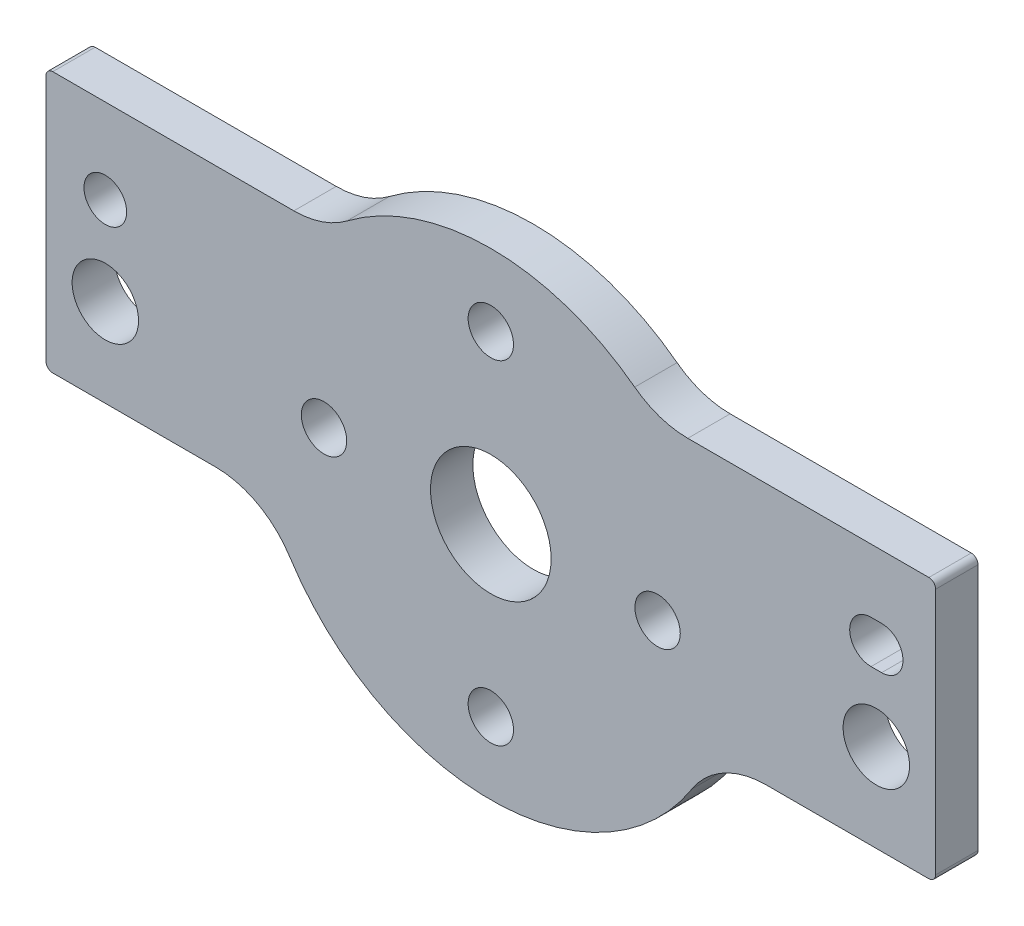
ISO-10303-21;
HEADER;
FILE_DESCRIPTION(('STEP AP214'),'2;1');
FILE_NAME('part.step','',(''),(''),'','','');
FILE_SCHEMA(('AUTOMOTIVE_DESIGN { 1 0 10303 214 1 1 1 1 }'));
ENDSEC;
DATA;
#1=APPLICATION_CONTEXT('core data for automotive mechanical design processes');
#2=APPLICATION_PROTOCOL_DEFINITION('international standard','automotive_design',2000,#1);
#3=PRODUCT_CONTEXT('',#1,'mechanical');
#4=PRODUCT('Part','Part','',(#3));
#5=PRODUCT_RELATED_PRODUCT_CATEGORY('part','',(#4));
#6=PRODUCT_DEFINITION_FORMATION('','',#4);
#7=PRODUCT_DEFINITION_CONTEXT('part definition',#1,'design');
#8=PRODUCT_DEFINITION('design','',#6,#7);
#9=PRODUCT_DEFINITION_SHAPE('','',#8);
#10=(LENGTH_UNIT() NAMED_UNIT(*) SI_UNIT(.MILLI.,.METRE.));
#11=(NAMED_UNIT(*) PLANE_ANGLE_UNIT() SI_UNIT($,.RADIAN.));
#12=(NAMED_UNIT(*) SI_UNIT($,.STERADIAN.) SOLID_ANGLE_UNIT());
#13=UNCERTAINTY_MEASURE_WITH_UNIT(LENGTH_MEASURE(1.E-05),#10,'distance_accuracy_value','');
#14=(GEOMETRIC_REPRESENTATION_CONTEXT(3) GLOBAL_UNCERTAINTY_ASSIGNED_CONTEXT((#13)) GLOBAL_UNIT_ASSIGNED_CONTEXT((#10,
#11,#12)) REPRESENTATION_CONTEXT('',''));
#15=CARTESIAN_POINT('',(0.,0.,0.));
#16=DIRECTION('',(0.,0.,1.));
#17=DIRECTION('',(1.,0.,0.));
#18=AXIS2_PLACEMENT_3D('',#15,#16,#17);
#19=CARTESIAN_POINT('',(0.,0.,3.175));
#20=DIRECTION('',(0.,0.,-1.));
#21=DIRECTION('',(-1.,0.,0.));
#22=AXIS2_PLACEMENT_3D('',#19,#20,#21);
#23=PLANE('',#22);
#24=CARTESIAN_POINT('',(-28.8925,6.604,3.175));
#25=DIRECTION('',(0.,0.,1.));
#26=DIRECTION('',(1.,0.,0.));
#27=AXIS2_PLACEMENT_3D('',#24,#25,#26);
#28=CIRCLE('',#27,1.6002);
#29=CARTESIAN_POINT('',(-27.2923,6.604,3.175));
#30=VERTEX_POINT('',#29);
#31=EDGE_CURVE('E201',#30,#30,#28,.T.);
#32=ORIENTED_EDGE('',*,*,#31,.F.);
#33=EDGE_LOOP('',(#32));
#34=FACE_BOUND('',#33,.T.);
#35=DIRECTION('',(1.,0.,0.));
#36=VECTOR('',#35,1.);
#37=CARTESIAN_POINT('',(28.495625,5.0038,3.175));
#38=LINE('',#37,#36);
#39=CARTESIAN_POINT('',(28.495625,5.0038,3.175));
#40=VERTEX_POINT('',#39);
#41=CARTESIAN_POINT('',(29.289375,5.0038,3.175));
#42=VERTEX_POINT('',#41);
#43=EDGE_CURVE('E199',#40,#42,#38,.T.);
#44=ORIENTED_EDGE('',*,*,#43,.F.);
#45=CARTESIAN_POINT('',(28.495625,6.604,3.175));
#46=DIRECTION('',(0.,0.,1.));
#47=DIRECTION('',(1.,0.,0.));
#48=AXIS2_PLACEMENT_3D('',#45,#46,#47);
#49=CIRCLE('',#48,1.6002);
#50=CARTESIAN_POINT('',(28.495625,8.20419999999999,3.175));
#51=VERTEX_POINT('',#50);
#52=EDGE_CURVE('E56',#51,#40,#49,.T.);
#53=ORIENTED_EDGE('',*,*,#52,.F.);
#54=DIRECTION('',(-1.,0.,0.));
#55=VECTOR('',#54,1.);
#56=CARTESIAN_POINT('',(28.495625,8.20419999999999,3.175));
#57=LINE('',#56,#55);
#58=CARTESIAN_POINT('',(29.289375,8.20419999999999,3.175));
#59=VERTEX_POINT('',#58);
#60=EDGE_CURVE('E188',#59,#51,#57,.T.);
#61=ORIENTED_EDGE('',*,*,#60,.F.);
#62=CARTESIAN_POINT('',(29.289375,6.604,3.175));
#63=DIRECTION('',(0.,0.,1.));
#64=DIRECTION('',(1.,0.,0.));
#65=AXIS2_PLACEMENT_3D('',#62,#63,#64);
#66=CIRCLE('',#65,1.6002);
#67=EDGE_CURVE('E194',#42,#59,#66,.T.);
#68=ORIENTED_EDGE('',*,*,#67,.F.);
#69=EDGE_LOOP('',(#44,#53,#61,#68));
#70=FACE_BOUND('',#69,.T.);
#71=CARTESIAN_POINT('',(0.,12.5,3.175));
#72=DIRECTION('',(0.,0.,1.));
#73=DIRECTION('',(1.,0.,0.));
#74=AXIS2_PLACEMENT_3D('',#71,#72,#73);
#75=CIRCLE('',#74,1.7);
#76=CARTESIAN_POINT('',(1.7,12.5,3.175));
#77=VERTEX_POINT('',#76);
#78=EDGE_CURVE('E224',#77,#77,#75,.T.);
#79=ORIENTED_EDGE('',*,*,#78,.F.);
#80=EDGE_LOOP('',(#79));
#81=FACE_BOUND('',#80,.T.);
#82=CARTESIAN_POINT('',(-12.5,0.,3.175));
#83=DIRECTION('',(0.,0.,1.));
#84=DIRECTION('',(1.,0.,0.));
#85=AXIS2_PLACEMENT_3D('',#82,#83,#84);
#86=CIRCLE('',#85,1.7);
#87=CARTESIAN_POINT('',(-10.8,0.,3.175));
#88=VERTEX_POINT('',#87);
#89=EDGE_CURVE('E232',#88,#88,#86,.T.);
#90=ORIENTED_EDGE('',*,*,#89,.F.);
#91=EDGE_LOOP('',(#90));
#92=FACE_BOUND('',#91,.T.);
#93=CARTESIAN_POINT('',(0.,-12.5,3.175));
#94=DIRECTION('',(0.,0.,1.));
#95=DIRECTION('',(1.,0.,0.));
#96=AXIS2_PLACEMENT_3D('',#93,#94,#95);
#97=CIRCLE('',#96,1.7);
#98=CARTESIAN_POINT('',(1.7,-12.5,3.175));
#99=VERTEX_POINT('',#98);
#100=EDGE_CURVE('E240',#99,#99,#97,.T.);
#101=ORIENTED_EDGE('',*,*,#100,.F.);
#102=EDGE_LOOP('',(#101));
#103=FACE_BOUND('',#102,.T.);
#104=CARTESIAN_POINT('',(0.,0.,3.175));
#105=DIRECTION('',(0.,0.,1.));
#106=DIRECTION('',(1.,0.,0.));
#107=AXIS2_PLACEMENT_3D('',#104,#105,#106);
#108=CIRCLE('',#107,4.5212);
#109=CARTESIAN_POINT('',(4.5212,0.,3.175));
#110=VERTEX_POINT('',#109);
#111=EDGE_CURVE('E256',#110,#110,#108,.T.);
#112=ORIENTED_EDGE('',*,*,#111,.F.);
#113=EDGE_LOOP('',(#112));
#114=FACE_BOUND('',#113,.T.);
#115=CARTESIAN_POINT('',(28.8925,0.,3.175));
#116=DIRECTION('',(0.,0.,1.));
#117=DIRECTION('',(1.,0.,0.));
#118=AXIS2_PLACEMENT_3D('',#115,#116,#117);
#119=CIRCLE('',#118,2.48919999999999);
#120=CARTESIAN_POINT('',(31.3817,0.,3.175));
#121=VERTEX_POINT('',#120);
#122=EDGE_CURVE('E261',#121,#121,#119,.T.);
#123=ORIENTED_EDGE('',*,*,#122,.F.);
#124=EDGE_LOOP('',(#123));
#125=FACE_BOUND('',#124,.T.);
#126=CARTESIAN_POINT('',(-28.8925,0.,3.175));
#127=DIRECTION('',(0.,0.,1.));
#128=DIRECTION('',(1.,0.,0.));
#129=AXIS2_PLACEMENT_3D('',#126,#127,#128);
#130=CIRCLE('',#129,2.48919999999999);
#131=CARTESIAN_POINT('',(-26.4033,0.,3.175));
#132=VERTEX_POINT('',#131);
#133=EDGE_CURVE('E272',#132,#132,#130,.T.);
#134=ORIENTED_EDGE('',*,*,#133,.F.);
#135=EDGE_LOOP('',(#134));
#136=FACE_BOUND('',#135,.T.);
#137=DIRECTION('',(0.,1.,0.));
#138=VECTOR('',#137,1.);
#139=CARTESIAN_POINT('',(33.3375,6.604,3.175));
#140=LINE('',#139,#138);
#141=CARTESIAN_POINT('',(33.3375,-6.09599999999999,3.175));
#142=VERTEX_POINT('',#141);
#143=CARTESIAN_POINT('',(33.3375,12.446,3.175));
#144=VERTEX_POINT('',#143);
#145=EDGE_CURVE('E308',#142,#144,#140,.T.);
#146=ORIENTED_EDGE('',*,*,#145,.T.);
#147=CARTESIAN_POINT('',(32.8295,12.446,3.175));
#148=DIRECTION('',(0.,0.,-1.));
#149=DIRECTION('',(-1.,0.,0.));
#150=AXIS2_PLACEMENT_3D('',#147,#148,#149);
#151=CIRCLE('',#150,0.508);
#152=CARTESIAN_POINT('',(32.8295,12.954,3.175));
#153=VERTEX_POINT('',#152);
#154=EDGE_CURVE('E393',#144,#153,#151,.F.);
#155=ORIENTED_EDGE('',*,*,#154,.T.);
#156=DIRECTION('',(-1.,0.,0.));
#157=VECTOR('',#156,1.);
#158=CARTESIAN_POINT('',(33.3375,12.954,3.175));
#159=LINE('',#158,#157);
#160=CARTESIAN_POINT('',(14.7624744538306,12.954,3.175));
#161=VERTEX_POINT('',#160);
#162=EDGE_CURVE('E286',#153,#161,#159,.T.);
#163=ORIENTED_EDGE('',*,*,#162,.T.);
#164=CARTESIAN_POINT('',(14.7624744538306,19.558,3.175));
#165=DIRECTION('',(0.,0.,-1.));
#166=DIRECTION('',(-1.,0.,0.));
#167=AXIS2_PLACEMENT_3D('',#164,#165,#166);
#168=CIRCLE('',#167,6.604);
#169=CARTESIAN_POINT('',(10.7838839668449,14.2869817172707,3.175));
#170=VERTEX_POINT('',#169);
#171=EDGE_CURVE('E369',#161,#170,#168,.T.);
#172=ORIENTED_EDGE('',*,*,#171,.T.);
#173=CARTESIAN_POINT('',(0.,0.,3.175));
#174=DIRECTION('',(0.,0.,1.));
#175=DIRECTION('',(1.,0.,0.));
#176=AXIS2_PLACEMENT_3D('',#173,#174,#175);
#177=CIRCLE('',#176,17.9);
#178=CARTESIAN_POINT('',(-10.7838839668449,14.2869817172706,3.175));
#179=VERTEX_POINT('',#178);
#180=EDGE_CURVE('E295',#170,#179,#177,.T.);
#181=ORIENTED_EDGE('',*,*,#180,.T.);
#182=CARTESIAN_POINT('',(-14.7624744538306,19.558,3.175));
#183=DIRECTION('',(0.,0.,-1.));
#184=DIRECTION('',(-1.,0.,0.));
#185=AXIS2_PLACEMENT_3D('',#182,#183,#184);
#186=CIRCLE('',#185,6.604);
#187=CARTESIAN_POINT('',(-14.7624744538306,12.954,3.175));
#188=VERTEX_POINT('',#187);
#189=EDGE_CURVE('E366',#179,#188,#186,.T.);
#190=ORIENTED_EDGE('',*,*,#189,.T.);
#191=CARTESIAN_POINT('',(-32.8295,12.954,3.175));
#192=VERTEX_POINT('',#191);
#193=EDGE_CURVE('E280',#188,#192,#159,.T.);
#194=ORIENTED_EDGE('',*,*,#193,.T.);
#195=CARTESIAN_POINT('',(-32.8295,12.446,3.175));
#196=DIRECTION('',(0.,0.,-1.));
#197=DIRECTION('',(-1.,0.,0.));
#198=AXIS2_PLACEMENT_3D('',#195,#196,#197);
#199=CIRCLE('',#198,0.508);
#200=CARTESIAN_POINT('',(-33.3375,12.446,3.175));
#201=VERTEX_POINT('',#200);
#202=EDGE_CURVE('E390',#192,#201,#199,.F.);
#203=ORIENTED_EDGE('',*,*,#202,.T.);
#204=DIRECTION('',(0.,-1.,0.));
#205=VECTOR('',#204,1.);
#206=CARTESIAN_POINT('',(-33.3375,6.604,3.175));
#207=LINE('',#206,#205);
#208=CARTESIAN_POINT('',(-33.3375,-6.096,3.175));
#209=VERTEX_POINT('',#208);
#210=EDGE_CURVE('E299',#201,#209,#207,.T.);
#211=ORIENTED_EDGE('',*,*,#210,.T.);
#212=CARTESIAN_POINT('',(-32.8295,-6.096,3.175));
#213=DIRECTION('',(0.,0.,-1.));
#214=DIRECTION('',(-1.,0.,0.));
#215=AXIS2_PLACEMENT_3D('',#212,#213,#214);
#216=CIRCLE('',#215,0.508);
#217=CARTESIAN_POINT('',(-32.8295,-6.604,3.175));
#218=VERTEX_POINT('',#217);
#219=EDGE_CURVE('E384',#209,#218,#216,.F.);
#220=ORIENTED_EDGE('',*,*,#219,.T.);
#221=DIRECTION('',(1.,0.,0.));
#222=VECTOR('',#221,1.);
#223=CARTESIAN_POINT('',(33.3375,-6.604,3.175));
#224=LINE('',#223,#222);
#225=CARTESIAN_POINT('',(-20.6396403069433,-6.604,3.175));
#226=VERTEX_POINT('',#225);
#227=EDGE_CURVE('E305',#218,#226,#224,.T.);
#228=ORIENTED_EDGE('',*,*,#227,.T.);
#229=CARTESIAN_POINT('',(-20.6396403069433,-13.208,3.175));
#230=DIRECTION('',(0.,0.,-1.));
#231=DIRECTION('',(-1.,0.,0.));
#232=AXIS2_PLACEMENT_3D('',#229,#230,#231);
#233=CIRCLE('',#232,6.604);
#234=CARTESIAN_POINT('',(-15.0771123691759,-9.64835128958538,3.175));
#235=VERTEX_POINT('',#234);
#236=EDGE_CURVE('E356',#226,#235,#233,.T.);
#237=ORIENTED_EDGE('',*,*,#236,.T.);
#238=CARTESIAN_POINT('',(15.0771123691759,-9.64835128958537,3.175));
#239=VERTEX_POINT('',#238);
#240=EDGE_CURVE('E284',#235,#239,#177,.T.);
#241=ORIENTED_EDGE('',*,*,#240,.T.);
#242=CARTESIAN_POINT('',(20.6396403069433,-13.208,3.175));
#243=DIRECTION('',(0.,0.,-1.));
#244=DIRECTION('',(-1.,0.,0.));
#245=AXIS2_PLACEMENT_3D('',#242,#243,#244);
#246=CIRCLE('',#245,6.604);
#247=CARTESIAN_POINT('',(20.6396403069433,-6.604,3.175));
#248=VERTEX_POINT('',#247);
#249=EDGE_CURVE('E353',#239,#248,#246,.T.);
#250=ORIENTED_EDGE('',*,*,#249,.T.);
#251=CARTESIAN_POINT('',(32.8295,-6.604,3.175));
#252=VERTEX_POINT('',#251);
#253=EDGE_CURVE('E303',#248,#252,#224,.T.);
#254=ORIENTED_EDGE('',*,*,#253,.T.);
#255=CARTESIAN_POINT('',(32.8295,-6.09599999999999,3.175));
#256=DIRECTION('',(0.,0.,-1.));
#257=DIRECTION('',(-1.,0.,0.));
#258=AXIS2_PLACEMENT_3D('',#255,#256,#257);
#259=CIRCLE('',#258,0.508);
#260=EDGE_CURVE('E387',#252,#142,#259,.F.);
#261=ORIENTED_EDGE('',*,*,#260,.T.);
#262=EDGE_LOOP('',(#146,#155,#163,#172,#181,#190,#194,#203,#211,#220,#228,#237,#241,#250,#254,#261));
#263=FACE_BOUND('',#262,.T.);
#264=CARTESIAN_POINT('',(12.5,0.,3.175));
#265=DIRECTION('',(0.,0.,1.));
#266=DIRECTION('',(1.,0.,0.));
#267=AXIS2_PLACEMENT_3D('',#264,#265,#266);
#268=CIRCLE('',#267,1.7);
#269=CARTESIAN_POINT('',(14.2,0.,3.175));
#270=VERTEX_POINT('',#269);
#271=EDGE_CURVE('E248',#270,#270,#268,.T.);
#272=ORIENTED_EDGE('',*,*,#271,.F.);
#273=EDGE_LOOP('',(#272));
#274=FACE_BOUND('',#273,.T.);
#275=ADVANCED_FACE('F40',(#34,#70,#81,#92,#103,#114,#125,#136,#263,#274),#23,.F.);
#276=CARTESIAN_POINT('',(0.,0.,0.));
#277=DIRECTION('',(0.,0.,-1.));
#278=DIRECTION('',(-1.,0.,0.));
#279=AXIS2_PLACEMENT_3D('',#276,#277,#278);
#280=PLANE('',#279);
#281=CARTESIAN_POINT('',(-28.8925,6.604,0.));
#282=DIRECTION('',(0.,0.,1.));
#283=DIRECTION('',(1.,0.,0.));
#284=AXIS2_PLACEMENT_3D('',#281,#282,#283);
#285=CIRCLE('',#284,1.6002);
#286=CARTESIAN_POINT('',(-27.2923,6.604,0.));
#287=VERTEX_POINT('',#286);
#288=EDGE_CURVE('E207',#287,#287,#285,.T.);
#289=ORIENTED_EDGE('',*,*,#288,.T.);
#290=EDGE_LOOP('',(#289));
#291=FACE_BOUND('',#290,.T.);
#292=CARTESIAN_POINT('',(28.495625,6.604,0.));
#293=DIRECTION('',(0.,0.,1.));
#294=DIRECTION('',(1.,0.,0.));
#295=AXIS2_PLACEMENT_3D('',#292,#293,#294);
#296=CIRCLE('',#295,1.6002);
#297=CARTESIAN_POINT('',(28.495625,8.20419999999999,0.));
#298=VERTEX_POINT('',#297);
#299=CARTESIAN_POINT('',(28.495625,5.0038,0.));
#300=VERTEX_POINT('',#299);
#301=EDGE_CURVE('E180',#298,#300,#296,.T.);
#302=ORIENTED_EDGE('',*,*,#301,.T.);
#303=DIRECTION('',(1.,0.,0.));
#304=VECTOR('',#303,1.);
#305=CARTESIAN_POINT('',(28.495625,5.0038,0.));
#306=LINE('',#305,#304);
#307=CARTESIAN_POINT('',(29.289375,5.0038,0.));
#308=VERTEX_POINT('',#307);
#309=EDGE_CURVE('E218',#300,#308,#306,.T.);
#310=ORIENTED_EDGE('',*,*,#309,.T.);
#311=CARTESIAN_POINT('',(29.289375,6.604,0.));
#312=DIRECTION('',(0.,0.,1.));
#313=DIRECTION('',(1.,0.,0.));
#314=AXIS2_PLACEMENT_3D('',#311,#312,#313);
#315=CIRCLE('',#314,1.6002);
#316=CARTESIAN_POINT('',(29.289375,8.20419999999999,0.));
#317=VERTEX_POINT('',#316);
#318=EDGE_CURVE('E64',#308,#317,#315,.T.);
#319=ORIENTED_EDGE('',*,*,#318,.T.);
#320=DIRECTION('',(-1.,0.,0.));
#321=VECTOR('',#320,1.);
#322=CARTESIAN_POINT('',(28.495625,8.20419999999999,0.));
#323=LINE('',#322,#321);
#324=EDGE_CURVE('E212',#317,#298,#323,.T.);
#325=ORIENTED_EDGE('',*,*,#324,.T.);
#326=EDGE_LOOP('',(#302,#310,#319,#325));
#327=FACE_BOUND('',#326,.T.);
#328=CARTESIAN_POINT('',(0.,12.5,0.));
#329=DIRECTION('',(0.,0.,1.));
#330=DIRECTION('',(1.,0.,0.));
#331=AXIS2_PLACEMENT_3D('',#328,#329,#330);
#332=CIRCLE('',#331,1.7);
#333=CARTESIAN_POINT('',(1.7,12.5,0.));
#334=VERTEX_POINT('',#333);
#335=EDGE_CURVE('E228',#334,#334,#332,.T.);
#336=ORIENTED_EDGE('',*,*,#335,.T.);
#337=EDGE_LOOP('',(#336));
#338=FACE_BOUND('',#337,.T.);
#339=CARTESIAN_POINT('',(-12.5,0.,0.));
#340=DIRECTION('',(0.,0.,1.));
#341=DIRECTION('',(1.,0.,0.));
#342=AXIS2_PLACEMENT_3D('',#339,#340,#341);
#343=CIRCLE('',#342,1.7);
#344=CARTESIAN_POINT('',(-10.8,0.,0.));
#345=VERTEX_POINT('',#344);
#346=EDGE_CURVE('E236',#345,#345,#343,.T.);
#347=ORIENTED_EDGE('',*,*,#346,.T.);
#348=EDGE_LOOP('',(#347));
#349=FACE_BOUND('',#348,.T.);
#350=CARTESIAN_POINT('',(0.,-12.5,0.));
#351=DIRECTION('',(0.,0.,1.));
#352=DIRECTION('',(1.,0.,0.));
#353=AXIS2_PLACEMENT_3D('',#350,#351,#352);
#354=CIRCLE('',#353,1.7);
#355=CARTESIAN_POINT('',(1.7,-12.5,0.));
#356=VERTEX_POINT('',#355);
#357=EDGE_CURVE('E244',#356,#356,#354,.T.);
#358=ORIENTED_EDGE('',*,*,#357,.T.);
#359=EDGE_LOOP('',(#358));
#360=FACE_BOUND('',#359,.T.);
#361=DIRECTION('',(-1.,0.,0.));
#362=VECTOR('',#361,1.);
#363=CARTESIAN_POINT('',(33.3375,12.954,0.));
#364=LINE('',#363,#362);
#365=CARTESIAN_POINT('',(32.8295,12.954,0.));
#366=VERTEX_POINT('',#365);
#367=CARTESIAN_POINT('',(14.7624744538306,12.954,0.));
#368=VERTEX_POINT('',#367);
#369=EDGE_CURVE('E281',#366,#368,#364,.T.);
#370=ORIENTED_EDGE('',*,*,#369,.F.);
#371=CARTESIAN_POINT('',(32.8295,12.446,0.));
#372=DIRECTION('',(0.,0.,-1.));
#373=DIRECTION('',(-1.,0.,0.));
#374=AXIS2_PLACEMENT_3D('',#371,#372,#373);
#375=CIRCLE('',#374,0.508);
#376=CARTESIAN_POINT('',(33.3375,12.446,0.));
#377=VERTEX_POINT('',#376);
#378=EDGE_CURVE('E408',#366,#377,#375,.T.);
#379=ORIENTED_EDGE('',*,*,#378,.T.);
#380=DIRECTION('',(0.,1.,0.));
#381=VECTOR('',#380,1.);
#382=CARTESIAN_POINT('',(33.3375,6.604,0.));
#383=LINE('',#382,#381);
#384=CARTESIAN_POINT('',(33.3375,-6.09599999999999,0.));
#385=VERTEX_POINT('',#384);
#386=EDGE_CURVE('E304',#385,#377,#383,.T.);
#387=ORIENTED_EDGE('',*,*,#386,.F.);
#388=CARTESIAN_POINT('',(32.8295,-6.09599999999999,0.));
#389=DIRECTION('',(0.,0.,-1.));
#390=DIRECTION('',(-1.,0.,0.));
#391=AXIS2_PLACEMENT_3D('',#388,#389,#390);
#392=CIRCLE('',#391,0.508);
#393=CARTESIAN_POINT('',(32.8295,-6.604,0.));
#394=VERTEX_POINT('',#393);
#395=EDGE_CURVE('E402',#385,#394,#392,.T.);
#396=ORIENTED_EDGE('',*,*,#395,.T.);
#397=DIRECTION('',(1.,0.,0.));
#398=VECTOR('',#397,1.);
#399=CARTESIAN_POINT('',(33.3375,-6.604,0.));
#400=LINE('',#399,#398);
#401=CARTESIAN_POINT('',(20.6396403069433,-6.604,0.));
#402=VERTEX_POINT('',#401);
#403=EDGE_CURVE('E316',#402,#394,#400,.T.);
#404=ORIENTED_EDGE('',*,*,#403,.F.);
#405=CARTESIAN_POINT('',(20.6396403069433,-13.208,0.));
#406=DIRECTION('',(0.,0.,-1.));
#407=DIRECTION('',(-1.,0.,0.));
#408=AXIS2_PLACEMENT_3D('',#405,#406,#407);
#409=CIRCLE('',#408,6.604);
#410=CARTESIAN_POINT('',(15.0771123691759,-9.64835128958537,0.));
#411=VERTEX_POINT('',#410);
#412=EDGE_CURVE('E350',#402,#411,#409,.F.);
#413=ORIENTED_EDGE('',*,*,#412,.T.);
#414=CARTESIAN_POINT('',(0.,0.,0.));
#415=DIRECTION('',(0.,0.,1.));
#416=DIRECTION('',(1.,0.,0.));
#417=AXIS2_PLACEMENT_3D('',#414,#415,#416);
#418=CIRCLE('',#417,17.9);
#419=CARTESIAN_POINT('',(-15.0771123691759,-9.64835128958538,0.));
#420=VERTEX_POINT('',#419);
#421=EDGE_CURVE('E294',#420,#411,#418,.T.);
#422=ORIENTED_EDGE('',*,*,#421,.F.);
#423=CARTESIAN_POINT('',(-20.6396403069433,-13.208,0.));
#424=DIRECTION('',(0.,0.,-1.));
#425=DIRECTION('',(-1.,0.,0.));
#426=AXIS2_PLACEMENT_3D('',#423,#424,#425);
#427=CIRCLE('',#426,6.604);
#428=CARTESIAN_POINT('',(-20.6396403069433,-6.604,0.));
#429=VERTEX_POINT('',#428);
#430=EDGE_CURVE('E359',#420,#429,#427,.F.);
#431=ORIENTED_EDGE('',*,*,#430,.T.);
#432=CARTESIAN_POINT('',(-32.8295,-6.604,0.));
#433=VERTEX_POINT('',#432);
#434=EDGE_CURVE('E317',#433,#429,#400,.T.);
#435=ORIENTED_EDGE('',*,*,#434,.F.);
#436=CARTESIAN_POINT('',(-32.8295,-6.096,0.));
#437=DIRECTION('',(0.,0.,-1.));
#438=DIRECTION('',(-1.,0.,0.));
#439=AXIS2_PLACEMENT_3D('',#436,#437,#438);
#440=CIRCLE('',#439,0.508);
#441=CARTESIAN_POINT('',(-33.3375,-6.096,0.));
#442=VERTEX_POINT('',#441);
#443=EDGE_CURVE('E399',#433,#442,#440,.T.);
#444=ORIENTED_EDGE('',*,*,#443,.T.);
#445=DIRECTION('',(0.,-1.,0.));
#446=VECTOR('',#445,1.);
#447=CARTESIAN_POINT('',(-33.3375,6.604,0.));
#448=LINE('',#447,#446);
#449=CARTESIAN_POINT('',(-33.3375,12.446,0.));
#450=VERTEX_POINT('',#449);
#451=EDGE_CURVE('E293',#450,#442,#448,.T.);
#452=ORIENTED_EDGE('',*,*,#451,.F.);
#453=CARTESIAN_POINT('',(-32.8295,12.446,0.));
#454=DIRECTION('',(0.,0.,-1.));
#455=DIRECTION('',(-1.,0.,0.));
#456=AXIS2_PLACEMENT_3D('',#453,#454,#455);
#457=CIRCLE('',#456,0.508);
#458=CARTESIAN_POINT('',(-32.8295,12.954,0.));
#459=VERTEX_POINT('',#458);
#460=EDGE_CURVE('E405',#450,#459,#457,.T.);
#461=ORIENTED_EDGE('',*,*,#460,.T.);
#462=CARTESIAN_POINT('',(-14.7624744538306,12.954,0.));
#463=VERTEX_POINT('',#462);
#464=EDGE_CURVE('E285',#463,#459,#364,.T.);
#465=ORIENTED_EDGE('',*,*,#464,.F.);
#466=CARTESIAN_POINT('',(-14.7624744538306,19.558,0.));
#467=DIRECTION('',(0.,0.,-1.));
#468=DIRECTION('',(-1.,0.,0.));
#469=AXIS2_PLACEMENT_3D('',#466,#467,#468);
#470=CIRCLE('',#469,6.604);
#471=CARTESIAN_POINT('',(-10.7838839668449,14.2869817172706,0.));
#472=VERTEX_POINT('',#471);
#473=EDGE_CURVE('E363',#463,#472,#470,.F.);
#474=ORIENTED_EDGE('',*,*,#473,.T.);
#475=CARTESIAN_POINT('',(10.7838839668449,14.2869817172707,0.));
#476=VERTEX_POINT('',#475);
#477=EDGE_CURVE('E289',#476,#472,#418,.T.);
#478=ORIENTED_EDGE('',*,*,#477,.F.);
#479=CARTESIAN_POINT('',(14.7624744538306,19.558,0.));
#480=DIRECTION('',(0.,0.,-1.));
#481=DIRECTION('',(-1.,0.,0.));
#482=AXIS2_PLACEMENT_3D('',#479,#480,#481);
#483=CIRCLE('',#482,6.604);
#484=EDGE_CURVE('E372',#476,#368,#483,.F.);
#485=ORIENTED_EDGE('',*,*,#484,.T.);
#486=EDGE_LOOP('',(#370,#379,#387,#396,#404,#413,#422,#431,#435,#444,#452,#461,#465,#474,#478,#485));
#487=FACE_BOUND('',#486,.T.);
#488=CARTESIAN_POINT('',(-28.8925,0.,0.));
#489=DIRECTION('',(0.,0.,1.));
#490=DIRECTION('',(1.,0.,0.));
#491=AXIS2_PLACEMENT_3D('',#488,#489,#490);
#492=CIRCLE('',#491,2.4892);
#493=CARTESIAN_POINT('',(-26.4033,0.,0.));
#494=VERTEX_POINT('',#493);
#495=EDGE_CURVE('E276',#494,#494,#492,.T.);
#496=ORIENTED_EDGE('',*,*,#495,.T.);
#497=EDGE_LOOP('',(#496));
#498=FACE_BOUND('',#497,.T.);
#499=CARTESIAN_POINT('',(28.8925,0.,0.));
#500=DIRECTION('',(0.,0.,1.));
#501=DIRECTION('',(1.,0.,0.));
#502=AXIS2_PLACEMENT_3D('',#499,#500,#501);
#503=CIRCLE('',#502,2.4892);
#504=CARTESIAN_POINT('',(31.3817,0.,0.));
#505=VERTEX_POINT('',#504);
#506=EDGE_CURVE('E268',#505,#505,#503,.T.);
#507=ORIENTED_EDGE('',*,*,#506,.T.);
#508=EDGE_LOOP('',(#507));
#509=FACE_BOUND('',#508,.T.);
#510=CARTESIAN_POINT('',(0.,0.,0.));
#511=DIRECTION('',(0.,0.,1.));
#512=DIRECTION('',(1.,0.,0.));
#513=AXIS2_PLACEMENT_3D('',#510,#511,#512);
#514=CIRCLE('',#513,4.5212);
#515=CARTESIAN_POINT('',(4.5212,0.,0.));
#516=VERTEX_POINT('',#515);
#517=EDGE_CURVE('E257',#516,#516,#514,.T.);
#518=ORIENTED_EDGE('',*,*,#517,.T.);
#519=EDGE_LOOP('',(#518));
#520=FACE_BOUND('',#519,.T.);
#521=CARTESIAN_POINT('',(12.5,0.,0.));
#522=DIRECTION('',(0.,0.,1.));
#523=DIRECTION('',(1.,0.,0.));
#524=AXIS2_PLACEMENT_3D('',#521,#522,#523);
#525=CIRCLE('',#524,1.7);
#526=CARTESIAN_POINT('',(14.2,0.,0.));
#527=VERTEX_POINT('',#526);
#528=EDGE_CURVE('E252',#527,#527,#525,.T.);
#529=ORIENTED_EDGE('',*,*,#528,.T.);
#530=EDGE_LOOP('',(#529));
#531=FACE_BOUND('',#530,.T.);
#532=ADVANCED_FACE('F446',(#291,#327,#338,#349,#360,#487,#498,#509,#520,#531),#280,.T.);
#533=CARTESIAN_POINT('',(33.3375,-6.604,3.175));
#534=DIRECTION('',(0.,1.,0.));
#535=DIRECTION('',(-1.,0.,0.));
#536=AXIS2_PLACEMENT_3D('',#533,#534,#535);
#537=PLANE('',#536);
#538=ORIENTED_EDGE('',*,*,#227,.F.);
#539=DIRECTION('',(0.,0.,-1.));
#540=VECTOR('',#539,1.);
#541=CARTESIAN_POINT('',(-32.8295,-6.604,3.175));
#542=LINE('',#541,#540);
#543=EDGE_CURVE('E11',#218,#433,#542,.T.);
#544=ORIENTED_EDGE('',*,*,#543,.T.);
#545=ORIENTED_EDGE('',*,*,#434,.T.);
#546=DIRECTION('',(0.,0.,1.));
#547=VECTOR('',#546,1.);
#548=CARTESIAN_POINT('',(-20.6396403069433,-6.604,3.175));
#549=LINE('',#548,#547);
#550=EDGE_CURVE('E332',#429,#226,#549,.T.);
#551=ORIENTED_EDGE('',*,*,#550,.T.);
#552=EDGE_LOOP('',(#538,#544,#545,#551));
#553=FACE_BOUND('',#552,.T.);
#554=ADVANCED_FACE('F518',(#553),#537,.F.);
#555=CARTESIAN_POINT('',(-33.3375,6.604,3.175));
#556=DIRECTION('',(1.,0.,0.));
#557=DIRECTION('',(0.,0.,-1.));
#558=AXIS2_PLACEMENT_3D('',#555,#556,#557);
#559=PLANE('',#558);
#560=ORIENTED_EDGE('',*,*,#210,.F.);
#561=DIRECTION('',(0.,0.,1.));
#562=VECTOR('',#561,1.);
#563=CARTESIAN_POINT('',(-33.3375,12.446,0.));
#564=LINE('',#563,#562);
#565=EDGE_CURVE('E418',#201,#450,#564,.F.);
#566=ORIENTED_EDGE('',*,*,#565,.T.);
#567=ORIENTED_EDGE('',*,*,#451,.T.);
#568=DIRECTION('',(0.,0.,-1.));
#569=VECTOR('',#568,1.);
#570=CARTESIAN_POINT('',(-33.3375,-6.096,3.175));
#571=LINE('',#570,#569);
#572=EDGE_CURVE('E415',#442,#209,#571,.F.);
#573=ORIENTED_EDGE('',*,*,#572,.T.);
#574=EDGE_LOOP('',(#560,#566,#567,#573));
#575=FACE_BOUND('',#574,.T.);
#576=ADVANCED_FACE('F570',(#575),#559,.F.);
#577=ORIENTED_EDGE('',*,*,#403,.T.);
#578=DIRECTION('',(0.,0.,-1.));
#579=VECTOR('',#578,1.);
#580=CARTESIAN_POINT('',(32.8295,-6.604,3.175));
#581=LINE('',#580,#579);
#582=EDGE_CURVE('E49',#394,#252,#581,.F.);
#583=ORIENTED_EDGE('',*,*,#582,.T.);
#584=ORIENTED_EDGE('',*,*,#253,.F.);
#585=DIRECTION('',(0.,0.,1.));
#586=VECTOR('',#585,1.);
#587=CARTESIAN_POINT('',(20.6396403069433,-6.604,3.175));
#588=LINE('',#587,#586);
#589=EDGE_CURVE('E312',#248,#402,#588,.F.);
#590=ORIENTED_EDGE('',*,*,#589,.T.);
#591=EDGE_LOOP('',(#577,#583,#584,#590));
#592=FACE_BOUND('',#591,.T.);
#593=ADVANCED_FACE('F427',(#592),#537,.F.);
#594=CARTESIAN_POINT('',(33.3375,6.604,3.175));
#595=DIRECTION('',(-1.,0.,0.));
#596=DIRECTION('',(0.,0.,1.));
#597=AXIS2_PLACEMENT_3D('',#594,#595,#596);
#598=PLANE('',#597);
#599=ORIENTED_EDGE('',*,*,#386,.T.);
#600=DIRECTION('',(0.,0.,1.));
#601=VECTOR('',#600,1.);
#602=CARTESIAN_POINT('',(33.3375,12.446,3.175));
#603=LINE('',#602,#601);
#604=EDGE_CURVE('E380',#377,#144,#603,.T.);
#605=ORIENTED_EDGE('',*,*,#604,.T.);
#606=ORIENTED_EDGE('',*,*,#145,.F.);
#607=DIRECTION('',(0.,0.,-1.));
#608=VECTOR('',#607,1.);
#609=CARTESIAN_POINT('',(33.3375,-6.09599999999999,3.175));
#610=LINE('',#609,#608);
#611=EDGE_CURVE('E376',#142,#385,#610,.T.);
#612=ORIENTED_EDGE('',*,*,#611,.T.);
#613=EDGE_LOOP('',(#599,#605,#606,#612));
#614=FACE_BOUND('',#613,.T.);
#615=ADVANCED_FACE('F442',(#614),#598,.F.);
#616=CARTESIAN_POINT('',(0.,0.,0.));
#617=DIRECTION('',(0.,0.,1.));
#618=DIRECTION('',(1.,0.,0.));
#619=AXIS2_PLACEMENT_3D('',#616,#617,#618);
#620=CYLINDRICAL_SURFACE('',#619,17.9);
#621=ORIENTED_EDGE('',*,*,#477,.T.);
#622=DIRECTION('',(0.,0.,1.));
#623=VECTOR('',#622,1.);
#624=CARTESIAN_POINT('',(-10.7838839668449,14.2869817172706,0.));
#625=LINE('',#624,#623);
#626=EDGE_CURVE('E343',#472,#179,#625,.T.);
#627=ORIENTED_EDGE('',*,*,#626,.T.);
#628=ORIENTED_EDGE('',*,*,#180,.F.);
#629=DIRECTION('',(0.,0.,1.));
#630=VECTOR('',#629,1.);
#631=CARTESIAN_POINT('',(10.7838839668449,14.2869817172707,0.));
#632=LINE('',#631,#630);
#633=EDGE_CURVE('E340',#170,#476,#632,.F.);
#634=ORIENTED_EDGE('',*,*,#633,.T.);
#635=EDGE_LOOP('',(#621,#627,#628,#634));
#636=FACE_BOUND('',#635,.T.);
#637=ADVANCED_FACE('F464',(#636),#620,.T.);
#638=ORIENTED_EDGE('',*,*,#421,.T.);
#639=DIRECTION('',(0.,0.,1.));
#640=VECTOR('',#639,1.);
#641=CARTESIAN_POINT('',(15.0771123691759,-9.64835128958537,0.));
#642=LINE('',#641,#640);
#643=EDGE_CURVE('E329',#411,#239,#642,.T.);
#644=ORIENTED_EDGE('',*,*,#643,.T.);
#645=ORIENTED_EDGE('',*,*,#240,.F.);
#646=DIRECTION('',(0.,0.,1.));
#647=VECTOR('',#646,1.);
#648=CARTESIAN_POINT('',(-15.0771123691759,-9.64835128958537,0.));
#649=LINE('',#648,#647);
#650=EDGE_CURVE('E326',#235,#420,#649,.F.);
#651=ORIENTED_EDGE('',*,*,#650,.T.);
#652=EDGE_LOOP('',(#638,#644,#645,#651));
#653=FACE_BOUND('',#652,.T.);
#654=ADVANCED_FACE('F562',(#653),#620,.T.);
#655=CARTESIAN_POINT('',(33.3375,12.954,0.));
#656=DIRECTION('',(0.,1.,0.));
#657=DIRECTION('',(-1.,0.,0.));
#658=AXIS2_PLACEMENT_3D('',#655,#656,#657);
#659=PLANE('',#658);
#660=ORIENTED_EDGE('',*,*,#162,.F.);
#661=DIRECTION('',(0.,0.,1.));
#662=VECTOR('',#661,1.);
#663=CARTESIAN_POINT('',(32.8295,12.954,0.));
#664=LINE('',#663,#662);
#665=EDGE_CURVE('E396',#153,#366,#664,.F.);
#666=ORIENTED_EDGE('',*,*,#665,.T.);
#667=ORIENTED_EDGE('',*,*,#369,.T.);
#668=DIRECTION('',(0.,0.,-1.));
#669=VECTOR('',#668,1.);
#670=CARTESIAN_POINT('',(14.7624744538306,12.954,3.175));
#671=LINE('',#670,#669);
#672=EDGE_CURVE('E346',#368,#161,#671,.F.);
#673=ORIENTED_EDGE('',*,*,#672,.T.);
#674=EDGE_LOOP('',(#660,#666,#667,#673));
#675=FACE_BOUND('',#674,.T.);
#676=ADVANCED_FACE('F455',(#675),#659,.T.);
#677=ORIENTED_EDGE('',*,*,#464,.T.);
#678=DIRECTION('',(0.,0.,1.));
#679=VECTOR('',#678,1.);
#680=CARTESIAN_POINT('',(-32.8295,12.954,3.175));
#681=LINE('',#680,#679);
#682=EDGE_CURVE('E411',#459,#192,#681,.T.);
#683=ORIENTED_EDGE('',*,*,#682,.T.);
#684=ORIENTED_EDGE('',*,*,#193,.F.);
#685=DIRECTION('',(0.,0.,-1.));
#686=VECTOR('',#685,1.);
#687=CARTESIAN_POINT('',(-14.7624744538306,12.954,0.));
#688=LINE('',#687,#686);
#689=EDGE_CURVE('E336',#188,#463,#688,.T.);
#690=ORIENTED_EDGE('',*,*,#689,.T.);
#691=EDGE_LOOP('',(#677,#683,#684,#690));
#692=FACE_BOUND('',#691,.T.);
#693=ADVANCED_FACE('F474',(#692),#659,.T.);
#694=CARTESIAN_POINT('',(20.6396403069433,-13.208,0.));
#695=DIRECTION('',(0.,0.,1.));
#696=DIRECTION('',(1.,0.,0.));
#697=AXIS2_PLACEMENT_3D('',#694,#695,#696);
#698=CYLINDRICAL_SURFACE('',#697,6.604);
#699=ORIENTED_EDGE('',*,*,#249,.F.);
#700=ORIENTED_EDGE('',*,*,#643,.F.);
#701=ORIENTED_EDGE('',*,*,#412,.F.);
#702=ORIENTED_EDGE('',*,*,#589,.F.);
#703=EDGE_LOOP('',(#699,#700,#701,#702));
#704=FACE_BOUND('',#703,.T.);
#705=ADVANCED_FACE('F574',(#704),#698,.F.);
#706=CARTESIAN_POINT('',(-20.6396403069433,-13.208,0.));
#707=DIRECTION('',(0.,0.,1.));
#708=DIRECTION('',(1.,0.,0.));
#709=AXIS2_PLACEMENT_3D('',#706,#707,#708);
#710=CYLINDRICAL_SURFACE('',#709,6.604);
#711=ORIENTED_EDGE('',*,*,#430,.F.);
#712=ORIENTED_EDGE('',*,*,#650,.F.);
#713=ORIENTED_EDGE('',*,*,#236,.F.);
#714=ORIENTED_EDGE('',*,*,#550,.F.);
#715=EDGE_LOOP('',(#711,#712,#713,#714));
#716=FACE_BOUND('',#715,.T.);
#717=ADVANCED_FACE('F577',(#716),#710,.F.);
#718=CARTESIAN_POINT('',(-14.7624744538306,19.558,0.));
#719=DIRECTION('',(0.,0.,1.));
#720=DIRECTION('',(1.,0.,0.));
#721=AXIS2_PLACEMENT_3D('',#718,#719,#720);
#722=CYLINDRICAL_SURFACE('',#721,6.604);
#723=ORIENTED_EDGE('',*,*,#189,.F.);
#724=ORIENTED_EDGE('',*,*,#626,.F.);
#725=ORIENTED_EDGE('',*,*,#473,.F.);
#726=ORIENTED_EDGE('',*,*,#689,.F.);
#727=EDGE_LOOP('',(#723,#724,#725,#726));
#728=FACE_BOUND('',#727,.T.);
#729=ADVANCED_FACE('F468',(#728),#722,.F.);
#730=CARTESIAN_POINT('',(14.7624744538306,19.558,0.));
#731=DIRECTION('',(0.,0.,1.));
#732=DIRECTION('',(1.,0.,0.));
#733=AXIS2_PLACEMENT_3D('',#730,#731,#732);
#734=CYLINDRICAL_SURFACE('',#733,6.604);
#735=ORIENTED_EDGE('',*,*,#484,.F.);
#736=ORIENTED_EDGE('',*,*,#633,.F.);
#737=ORIENTED_EDGE('',*,*,#171,.F.);
#738=ORIENTED_EDGE('',*,*,#672,.F.);
#739=EDGE_LOOP('',(#735,#736,#737,#738));
#740=FACE_BOUND('',#739,.T.);
#741=ADVANCED_FACE('F459',(#740),#734,.F.);
#742=CARTESIAN_POINT('',(32.8295,12.446,3.175));
#743=DIRECTION('',(0.,0.,-1.));
#744=DIRECTION('',(-1.,0.,0.));
#745=AXIS2_PLACEMENT_3D('',#742,#743,#744);
#746=CYLINDRICAL_SURFACE('',#745,0.508);
#747=ORIENTED_EDGE('',*,*,#378,.F.);
#748=ORIENTED_EDGE('',*,*,#665,.F.);
#749=ORIENTED_EDGE('',*,*,#154,.F.);
#750=ORIENTED_EDGE('',*,*,#604,.F.);
#751=EDGE_LOOP('',(#747,#748,#749,#750));
#752=FACE_BOUND('',#751,.T.);
#753=ADVANCED_FACE('F451',(#752),#746,.T.);
#754=CARTESIAN_POINT('',(-32.8295,12.446,0.));
#755=DIRECTION('',(0.,0.,-1.));
#756=DIRECTION('',(-1.,0.,0.));
#757=AXIS2_PLACEMENT_3D('',#754,#755,#756);
#758=CYLINDRICAL_SURFACE('',#757,0.508);
#759=ORIENTED_EDGE('',*,*,#460,.F.);
#760=ORIENTED_EDGE('',*,*,#565,.F.);
#761=ORIENTED_EDGE('',*,*,#202,.F.);
#762=ORIENTED_EDGE('',*,*,#682,.F.);
#763=EDGE_LOOP('',(#759,#760,#761,#762));
#764=FACE_BOUND('',#763,.T.);
#765=ADVANCED_FACE('F588',(#764),#758,.T.);
#766=CARTESIAN_POINT('',(32.8295,-6.09599999999999,3.175));
#767=DIRECTION('',(0.,0.,-1.));
#768=DIRECTION('',(-1.,0.,0.));
#769=AXIS2_PLACEMENT_3D('',#766,#767,#768);
#770=CYLINDRICAL_SURFACE('',#769,0.508);
#771=ORIENTED_EDGE('',*,*,#260,.F.);
#772=ORIENTED_EDGE('',*,*,#582,.F.);
#773=ORIENTED_EDGE('',*,*,#395,.F.);
#774=ORIENTED_EDGE('',*,*,#611,.F.);
#775=EDGE_LOOP('',(#771,#772,#773,#774));
#776=FACE_BOUND('',#775,.T.);
#777=ADVANCED_FACE('F439',(#776),#770,.T.);
#778=CARTESIAN_POINT('',(-32.8295,-6.096,3.175));
#779=DIRECTION('',(0.,0.,-1.));
#780=DIRECTION('',(-1.,0.,0.));
#781=AXIS2_PLACEMENT_3D('',#778,#779,#780);
#782=CYLINDRICAL_SURFACE('',#781,0.508);
#783=ORIENTED_EDGE('',*,*,#219,.F.);
#784=ORIENTED_EDGE('',*,*,#572,.F.);
#785=ORIENTED_EDGE('',*,*,#443,.F.);
#786=ORIENTED_EDGE('',*,*,#543,.F.);
#787=EDGE_LOOP('',(#783,#784,#785,#786));
#788=FACE_BOUND('',#787,.T.);
#789=ADVANCED_FACE('F42',(#788),#782,.T.);
#790=CARTESIAN_POINT('',(-28.8925,0.,3.175));
#791=DIRECTION('',(0.,0.,1.));
#792=DIRECTION('',(1.,0.,0.));
#793=AXIS2_PLACEMENT_3D('',#790,#791,#792);
#794=CYLINDRICAL_SURFACE('',#793,2.48919999999999);
#795=ORIENTED_EDGE('',*,*,#495,.F.);
#796=EDGE_LOOP('',(#795));
#797=FACE_BOUND('',#796,.T.);
#798=ORIENTED_EDGE('',*,*,#133,.T.);
#799=EDGE_LOOP('',(#798));
#800=FACE_BOUND('',#799,.T.);
#801=ADVANCED_FACE('F544',(#797,#800),#794,.F.);
#802=CARTESIAN_POINT('',(28.8925,0.,3.175));
#803=DIRECTION('',(0.,0.,1.));
#804=DIRECTION('',(1.,0.,0.));
#805=AXIS2_PLACEMENT_3D('',#802,#803,#804);
#806=CYLINDRICAL_SURFACE('',#805,2.48919999999999);
#807=ORIENTED_EDGE('',*,*,#506,.F.);
#808=EDGE_LOOP('',(#807));
#809=FACE_BOUND('',#808,.T.);
#810=ORIENTED_EDGE('',*,*,#122,.T.);
#811=EDGE_LOOP('',(#810));
#812=FACE_BOUND('',#811,.T.);
#813=ADVANCED_FACE('F546',(#809,#812),#806,.F.);
#814=CARTESIAN_POINT('',(0.,0.,0.));
#815=DIRECTION('',(0.,0.,1.));
#816=DIRECTION('',(1.,0.,0.));
#817=AXIS2_PLACEMENT_3D('',#814,#815,#816);
#818=CYLINDRICAL_SURFACE('',#817,4.5212);
#819=ORIENTED_EDGE('',*,*,#517,.F.);
#820=EDGE_LOOP('',(#819));
#821=FACE_BOUND('',#820,.T.);
#822=ORIENTED_EDGE('',*,*,#111,.T.);
#823=EDGE_LOOP('',(#822));
#824=FACE_BOUND('',#823,.T.);
#825=ADVANCED_FACE('F553',(#821,#824),#818,.F.);
#826=CARTESIAN_POINT('',(12.5,0.,3.175));
#827=DIRECTION('',(0.,0.,1.));
#828=DIRECTION('',(1.,0.,0.));
#829=AXIS2_PLACEMENT_3D('',#826,#827,#828);
#830=CYLINDRICAL_SURFACE('',#829,1.7);
#831=ORIENTED_EDGE('',*,*,#528,.F.);
#832=EDGE_LOOP('',(#831));
#833=FACE_BOUND('',#832,.T.);
#834=ORIENTED_EDGE('',*,*,#271,.T.);
#835=EDGE_LOOP('',(#834));
#836=FACE_BOUND('',#835,.T.);
#837=ADVANCED_FACE('F530',(#833,#836),#830,.F.);
#838=CARTESIAN_POINT('',(0.,-12.5,3.175));
#839=DIRECTION('',(0.,0.,1.));
#840=DIRECTION('',(1.,0.,0.));
#841=AXIS2_PLACEMENT_3D('',#838,#839,#840);
#842=CYLINDRICAL_SURFACE('',#841,1.7);
#843=ORIENTED_EDGE('',*,*,#357,.F.);
#844=EDGE_LOOP('',(#843));
#845=FACE_BOUND('',#844,.T.);
#846=ORIENTED_EDGE('',*,*,#100,.T.);
#847=EDGE_LOOP('',(#846));
#848=FACE_BOUND('',#847,.T.);
#849=ADVANCED_FACE('F526',(#845,#848),#842,.F.);
#850=CARTESIAN_POINT('',(-12.5,0.,3.175));
#851=DIRECTION('',(0.,0.,1.));
#852=DIRECTION('',(1.,0.,0.));
#853=AXIS2_PLACEMENT_3D('',#850,#851,#852);
#854=CYLINDRICAL_SURFACE('',#853,1.7);
#855=ORIENTED_EDGE('',*,*,#346,.F.);
#856=EDGE_LOOP('',(#855));
#857=FACE_BOUND('',#856,.T.);
#858=ORIENTED_EDGE('',*,*,#89,.T.);
#859=EDGE_LOOP('',(#858));
#860=FACE_BOUND('',#859,.T.);
#861=ADVANCED_FACE('F529',(#857,#860),#854,.F.);
#862=CARTESIAN_POINT('',(0.,12.5,3.175));
#863=DIRECTION('',(0.,0.,1.));
#864=DIRECTION('',(1.,0.,0.));
#865=AXIS2_PLACEMENT_3D('',#862,#863,#864);
#866=CYLINDRICAL_SURFACE('',#865,1.7);
#867=ORIENTED_EDGE('',*,*,#335,.F.);
#868=EDGE_LOOP('',(#867));
#869=FACE_BOUND('',#868,.T.);
#870=ORIENTED_EDGE('',*,*,#78,.T.);
#871=EDGE_LOOP('',(#870));
#872=FACE_BOUND('',#871,.T.);
#873=ADVANCED_FACE('F650',(#869,#872),#866,.F.);
#874=CARTESIAN_POINT('',(28.495625,6.604,0.));
#875=DIRECTION('',(0.,0.,1.));
#876=DIRECTION('',(1.,0.,0.));
#877=AXIS2_PLACEMENT_3D('',#874,#875,#876);
#878=CYLINDRICAL_SURFACE('',#877,1.6002);
#879=ORIENTED_EDGE('',*,*,#52,.T.);
#880=DIRECTION('',(0.,0.,1.));
#881=VECTOR('',#880,1.);
#882=CARTESIAN_POINT('',(28.495625,5.0038,0.));
#883=LINE('',#882,#881);
#884=EDGE_CURVE('E215',#300,#40,#883,.T.);
#885=ORIENTED_EDGE('',*,*,#884,.F.);
#886=ORIENTED_EDGE('',*,*,#301,.F.);
#887=DIRECTION('',(0.,0.,1.));
#888=VECTOR('',#887,1.);
#889=CARTESIAN_POINT('',(28.495625,8.20419999999999,0.));
#890=LINE('',#889,#888);
#891=EDGE_CURVE('E176',#298,#51,#890,.T.);
#892=ORIENTED_EDGE('',*,*,#891,.T.);
#893=EDGE_LOOP('',(#879,#885,#886,#892));
#894=FACE_BOUND('',#893,.T.);
#895=ADVANCED_FACE('F178',(#894),#878,.F.);
#896=CARTESIAN_POINT('',(28.495625,8.20419999999999,0.));
#897=DIRECTION('',(0.,1.,0.));
#898=DIRECTION('',(0.,0.,1.));
#899=AXIS2_PLACEMENT_3D('',#896,#897,#898);
#900=PLANE('',#899);
#901=ORIENTED_EDGE('',*,*,#60,.T.);
#902=ORIENTED_EDGE('',*,*,#891,.F.);
#903=ORIENTED_EDGE('',*,*,#324,.F.);
#904=DIRECTION('',(0.,0.,1.));
#905=VECTOR('',#904,1.);
#906=CARTESIAN_POINT('',(29.289375,8.20419999999999,0.));
#907=LINE('',#906,#905);
#908=EDGE_CURVE('E185',#317,#59,#907,.T.);
#909=ORIENTED_EDGE('',*,*,#908,.T.);
#910=EDGE_LOOP('',(#901,#902,#903,#909));
#911=FACE_BOUND('',#910,.T.);
#912=ADVANCED_FACE('F189',(#911),#900,.F.);
#913=CARTESIAN_POINT('',(29.289375,6.604,0.));
#914=DIRECTION('',(0.,0.,1.));
#915=DIRECTION('',(1.,0.,0.));
#916=AXIS2_PLACEMENT_3D('',#913,#914,#915);
#917=CYLINDRICAL_SURFACE('',#916,1.6002);
#918=ORIENTED_EDGE('',*,*,#67,.T.);
#919=ORIENTED_EDGE('',*,*,#908,.F.);
#920=ORIENTED_EDGE('',*,*,#318,.F.);
#921=DIRECTION('',(0.,0.,1.));
#922=VECTOR('',#921,1.);
#923=CARTESIAN_POINT('',(29.289375,5.0038,0.));
#924=LINE('',#923,#922);
#925=EDGE_CURVE('E505',#308,#42,#924,.T.);
#926=ORIENTED_EDGE('',*,*,#925,.T.);
#927=EDGE_LOOP('',(#918,#919,#920,#926));
#928=FACE_BOUND('',#927,.T.);
#929=ADVANCED_FACE('F511',(#928),#917,.F.);
#930=CARTESIAN_POINT('',(28.495625,5.0038,0.));
#931=DIRECTION('',(0.,-1.,0.));
#932=DIRECTION('',(0.,0.,-1.));
#933=AXIS2_PLACEMENT_3D('',#930,#931,#932);
#934=PLANE('',#933);
#935=ORIENTED_EDGE('',*,*,#43,.T.);
#936=ORIENTED_EDGE('',*,*,#925,.F.);
#937=ORIENTED_EDGE('',*,*,#309,.F.);
#938=ORIENTED_EDGE('',*,*,#884,.T.);
#939=EDGE_LOOP('',(#935,#936,#937,#938));
#940=FACE_BOUND('',#939,.T.);
#941=ADVANCED_FACE('F514',(#940),#934,.F.);
#942=CARTESIAN_POINT('',(-28.8925,6.604,0.));
#943=DIRECTION('',(0.,0.,1.));
#944=DIRECTION('',(1.,0.,0.));
#945=AXIS2_PLACEMENT_3D('',#942,#943,#944);
#946=CYLINDRICAL_SURFACE('',#945,1.6002);
#947=ORIENTED_EDGE('',*,*,#288,.F.);
#948=EDGE_LOOP('',(#947));
#949=FACE_BOUND('',#948,.T.);
#950=ORIENTED_EDGE('',*,*,#31,.T.);
#951=EDGE_LOOP('',(#950));
#952=FACE_BOUND('',#951,.T.);
#953=ADVANCED_FACE('F710',(#949,#952),#946,.F.);
#954=CLOSED_SHELL('',(#275,#532,#554,#576,#593,#615,#637,#654,#676,#693,#705,#717,#729,#741,
#753,#765,#777,#789,#801,#813,#825,#837,#849,#861,#873,#895,#912,#929,#941,#953));
#955=MANIFOLD_SOLID_BREP('B2',#954);
#956=ADVANCED_BREP_SHAPE_REPRESENTATION('',(#18,#955),#14);
#957=SHAPE_DEFINITION_REPRESENTATION(#9,#956);
ENDSEC;
END-ISO-10303-21;
